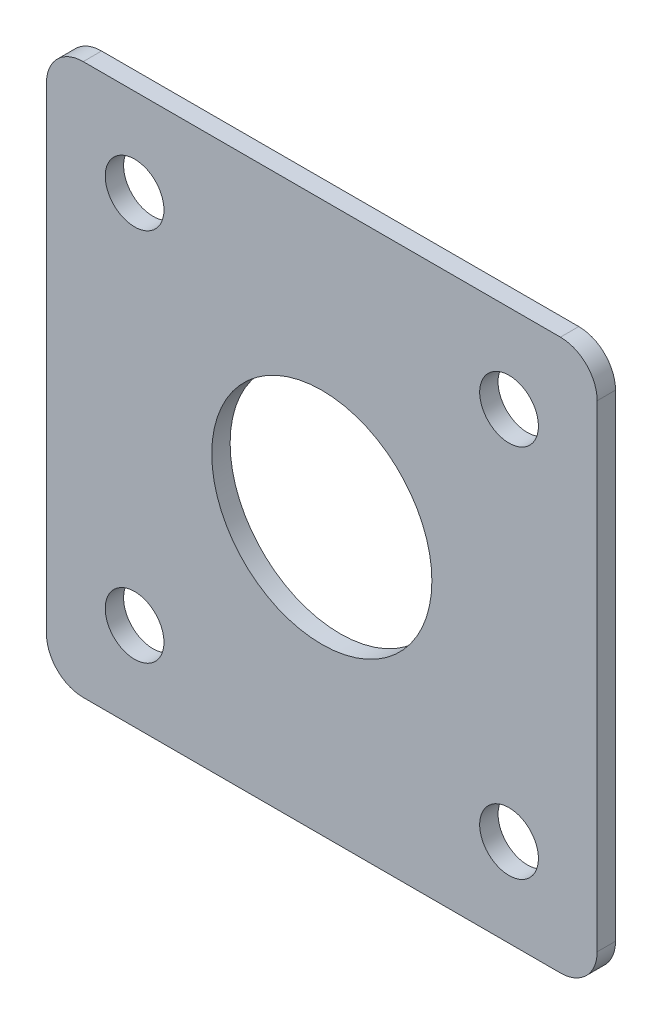
ISO-10303-21;
HEADER;
FILE_DESCRIPTION(('STEP AP214'),'2;1');
FILE_NAME('part.step','',(''),(''),'','','');
FILE_SCHEMA(('AUTOMOTIVE_DESIGN { 1 0 10303 214 1 1 1 1 }'));
ENDSEC;
DATA;
#1=APPLICATION_CONTEXT('core data for automotive mechanical design processes');
#2=APPLICATION_PROTOCOL_DEFINITION('international standard','automotive_design',2000,#1);
#3=PRODUCT_CONTEXT('',#1,'mechanical');
#4=PRODUCT('Part','Part','',(#3));
#5=PRODUCT_RELATED_PRODUCT_CATEGORY('part','',(#4));
#6=PRODUCT_DEFINITION_FORMATION('','',#4);
#7=PRODUCT_DEFINITION_CONTEXT('part definition',#1,'design');
#8=PRODUCT_DEFINITION('design','',#6,#7);
#9=PRODUCT_DEFINITION_SHAPE('','',#8);
#10=(LENGTH_UNIT() NAMED_UNIT(*) SI_UNIT(.MILLI.,.METRE.));
#11=(NAMED_UNIT(*) PLANE_ANGLE_UNIT() SI_UNIT($,.RADIAN.));
#12=(NAMED_UNIT(*) SI_UNIT($,.STERADIAN.) SOLID_ANGLE_UNIT());
#13=UNCERTAINTY_MEASURE_WITH_UNIT(LENGTH_MEASURE(1.E-05),#10,'distance_accuracy_value','');
#14=(GEOMETRIC_REPRESENTATION_CONTEXT(3) GLOBAL_UNCERTAINTY_ASSIGNED_CONTEXT((#13)) GLOBAL_UNIT_ASSIGNED_CONTEXT((#10,
#11,#12)) REPRESENTATION_CONTEXT('',''));
#15=CARTESIAN_POINT('',(0.,0.,0.));
#16=DIRECTION('',(0.,0.,1.));
#17=DIRECTION('',(1.,0.,0.));
#18=AXIS2_PLACEMENT_3D('',#15,#16,#17);
#19=CARTESIAN_POINT('',(0.,0.,5.));
#20=DIRECTION('',(0.,0.,1.));
#21=DIRECTION('',(1.,0.,0.));
#22=AXIS2_PLACEMENT_3D('',#19,#20,#21);
#23=PLANE('',#22);
#24=CARTESIAN_POINT('',(-51.,-51.,5.));
#25=DIRECTION('',(0.,0.,1.));
#26=DIRECTION('',(1.,0.,0.));
#27=AXIS2_PLACEMENT_3D('',#24,#25,#26);
#28=CIRCLE('',#27,8.);
#29=CARTESIAN_POINT('',(-43.,-51.,5.));
#30=VERTEX_POINT('',#29);
#31=EDGE_CURVE('E229',#30,#30,#28,.T.);
#32=ORIENTED_EDGE('',*,*,#31,.F.);
#33=EDGE_LOOP('',(#32));
#34=FACE_BOUND('',#33,.T.);
#35=CARTESIAN_POINT('',(51.,51.,5.));
#36=DIRECTION('',(0.,0.,1.));
#37=DIRECTION('',(1.,0.,0.));
#38=AXIS2_PLACEMENT_3D('',#35,#36,#37);
#39=CIRCLE('',#38,8.);
#40=CARTESIAN_POINT('',(59.,51.,5.));
#41=VERTEX_POINT('',#40);
#42=EDGE_CURVE('E215',#41,#41,#39,.T.);
#43=ORIENTED_EDGE('',*,*,#42,.F.);
#44=EDGE_LOOP('',(#43));
#45=FACE_BOUND('',#44,.T.);
#46=DIRECTION('',(1.,0.,0.));
#47=VECTOR('',#46,1.);
#48=CARTESIAN_POINT('',(75.,-75.,5.));
#49=LINE('',#48,#47);
#50=CARTESIAN_POINT('',(-65.,-75.,5.));
#51=VERTEX_POINT('',#50);
#52=CARTESIAN_POINT('',(65.,-75.,5.));
#53=VERTEX_POINT('',#52);
#54=EDGE_CURVE('E195',#51,#53,#49,.T.);
#55=ORIENTED_EDGE('',*,*,#54,.T.);
#56=CARTESIAN_POINT('',(65.,-65.,5.));
#57=DIRECTION('',(0.,0.,1.));
#58=DIRECTION('',(1.,0.,0.));
#59=AXIS2_PLACEMENT_3D('',#56,#57,#58);
#60=CIRCLE('',#59,10.);
#61=CARTESIAN_POINT('',(75.,-65.,5.));
#62=VERTEX_POINT('',#61);
#63=EDGE_CURVE('E168',#53,#62,#60,.T.);
#64=ORIENTED_EDGE('',*,*,#63,.T.);
#65=DIRECTION('',(0.,1.,0.));
#66=VECTOR('',#65,1.);
#67=CARTESIAN_POINT('',(75.,-75.,5.));
#68=LINE('',#67,#66);
#69=CARTESIAN_POINT('',(75.,65.,5.));
#70=VERTEX_POINT('',#69);
#71=EDGE_CURVE('E125',#62,#70,#68,.T.);
#72=ORIENTED_EDGE('',*,*,#71,.T.);
#73=CARTESIAN_POINT('',(65.,65.,5.));
#74=DIRECTION('',(0.,0.,1.));
#75=DIRECTION('',(1.,0.,0.));
#76=AXIS2_PLACEMENT_3D('',#73,#74,#75);
#77=CIRCLE('',#76,10.);
#78=CARTESIAN_POINT('',(65.,75.,5.));
#79=VERTEX_POINT('',#78);
#80=EDGE_CURVE('E60',#70,#79,#77,.T.);
#81=ORIENTED_EDGE('',*,*,#80,.T.);
#82=DIRECTION('',(-1.,0.,0.));
#83=VECTOR('',#82,1.);
#84=CARTESIAN_POINT('',(75.,75.,5.));
#85=LINE('',#84,#83);
#86=CARTESIAN_POINT('',(-65.,75.,5.));
#87=VERTEX_POINT('',#86);
#88=EDGE_CURVE('E146',#79,#87,#85,.T.);
#89=ORIENTED_EDGE('',*,*,#88,.T.);
#90=CARTESIAN_POINT('',(-65.,65.,5.));
#91=DIRECTION('',(0.,0.,1.));
#92=DIRECTION('',(1.,0.,0.));
#93=AXIS2_PLACEMENT_3D('',#90,#91,#92);
#94=CIRCLE('',#93,10.);
#95=CARTESIAN_POINT('',(-75.,65.,5.));
#96=VERTEX_POINT('',#95);
#97=EDGE_CURVE('E162',#87,#96,#94,.T.);
#98=ORIENTED_EDGE('',*,*,#97,.T.);
#99=DIRECTION('',(0.,-1.,0.));
#100=VECTOR('',#99,1.);
#101=CARTESIAN_POINT('',(-75.,-75.,5.));
#102=LINE('',#101,#100);
#103=CARTESIAN_POINT('',(-75.,-65.,5.));
#104=VERTEX_POINT('',#103);
#105=EDGE_CURVE('E139',#96,#104,#102,.T.);
#106=ORIENTED_EDGE('',*,*,#105,.T.);
#107=CARTESIAN_POINT('',(-65.,-65.,5.));
#108=DIRECTION('',(0.,0.,1.));
#109=DIRECTION('',(1.,0.,0.));
#110=AXIS2_PLACEMENT_3D('',#107,#108,#109);
#111=CIRCLE('',#110,10.);
#112=EDGE_CURVE('E165',#104,#51,#111,.T.);
#113=ORIENTED_EDGE('',*,*,#112,.T.);
#114=EDGE_LOOP('',(#55,#64,#72,#81,#89,#98,#106,#113));
#115=FACE_BOUND('',#114,.T.);
#116=CARTESIAN_POINT('',(0.,0.,5.));
#117=DIRECTION('',(0.,0.,1.));
#118=DIRECTION('',(1.,0.,0.));
#119=AXIS2_PLACEMENT_3D('',#116,#117,#118);
#120=CIRCLE('',#119,29.98);
#121=CARTESIAN_POINT('',(29.98,0.,5.));
#122=VERTEX_POINT('',#121);
#123=EDGE_CURVE('E208',#122,#122,#120,.T.);
#124=ORIENTED_EDGE('',*,*,#123,.F.);
#125=EDGE_LOOP('',(#124));
#126=FACE_BOUND('',#125,.T.);
#127=CARTESIAN_POINT('',(-51.,51.,5.));
#128=DIRECTION('',(0.,0.,1.));
#129=DIRECTION('',(1.,0.,0.));
#130=AXIS2_PLACEMENT_3D('',#127,#128,#129);
#131=CIRCLE('',#130,8.);
#132=CARTESIAN_POINT('',(-43.,51.,5.));
#133=VERTEX_POINT('',#132);
#134=EDGE_CURVE('E221',#133,#133,#131,.T.);
#135=ORIENTED_EDGE('',*,*,#134,.F.);
#136=EDGE_LOOP('',(#135));
#137=FACE_BOUND('',#136,.T.);
#138=CARTESIAN_POINT('',(51.,-51.,5.));
#139=DIRECTION('',(0.,0.,1.));
#140=DIRECTION('',(1.,0.,0.));
#141=AXIS2_PLACEMENT_3D('',#138,#139,#140);
#142=CIRCLE('',#141,8.);
#143=CARTESIAN_POINT('',(59.,-51.,5.));
#144=VERTEX_POINT('',#143);
#145=EDGE_CURVE('E237',#144,#144,#142,.T.);
#146=ORIENTED_EDGE('',*,*,#145,.F.);
#147=EDGE_LOOP('',(#146));
#148=FACE_BOUND('',#147,.T.);
#149=ADVANCED_FACE('F39',(#34,#45,#115,#126,#137,#148),#23,.T.);
#150=CARTESIAN_POINT('',(0.,0.,0.));
#151=DIRECTION('',(0.,0.,1.));
#152=DIRECTION('',(1.,0.,0.));
#153=AXIS2_PLACEMENT_3D('',#150,#151,#152);
#154=PLANE('',#153);
#155=DIRECTION('',(0.,1.,0.));
#156=VECTOR('',#155,1.);
#157=CARTESIAN_POINT('',(75.,-75.,0.));
#158=LINE('',#157,#156);
#159=CARTESIAN_POINT('',(75.,-65.,0.));
#160=VERTEX_POINT('',#159);
#161=CARTESIAN_POINT('',(75.,65.,0.));
#162=VERTEX_POINT('',#161);
#163=EDGE_CURVE('E123',#160,#162,#158,.T.);
#164=ORIENTED_EDGE('',*,*,#163,.F.);
#165=CARTESIAN_POINT('',(65.,-65.,0.));
#166=DIRECTION('',(0.,0.,1.));
#167=DIRECTION('',(1.,0.,0.));
#168=AXIS2_PLACEMENT_3D('',#165,#166,#167);
#169=CIRCLE('',#168,10.);
#170=CARTESIAN_POINT('',(65.,-75.,0.));
#171=VERTEX_POINT('',#170);
#172=EDGE_CURVE('E105',#160,#171,#169,.F.);
#173=ORIENTED_EDGE('',*,*,#172,.T.);
#174=DIRECTION('',(1.,0.,0.));
#175=VECTOR('',#174,1.);
#176=CARTESIAN_POINT('',(75.,-75.,0.));
#177=LINE('',#176,#175);
#178=CARTESIAN_POINT('',(-65.,-75.,0.));
#179=VERTEX_POINT('',#178);
#180=EDGE_CURVE('E135',#179,#171,#177,.T.);
#181=ORIENTED_EDGE('',*,*,#180,.F.);
#182=CARTESIAN_POINT('',(-65.,-65.,0.));
#183=DIRECTION('',(0.,0.,1.));
#184=DIRECTION('',(1.,0.,0.));
#185=AXIS2_PLACEMENT_3D('',#182,#183,#184);
#186=CIRCLE('',#185,10.);
#187=CARTESIAN_POINT('',(-75.,-65.,0.));
#188=VERTEX_POINT('',#187);
#189=EDGE_CURVE('E117',#179,#188,#186,.F.);
#190=ORIENTED_EDGE('',*,*,#189,.T.);
#191=DIRECTION('',(0.,-1.,0.));
#192=VECTOR('',#191,1.);
#193=CARTESIAN_POINT('',(-75.,-75.,0.));
#194=LINE('',#193,#192);
#195=CARTESIAN_POINT('',(-75.,65.,0.));
#196=VERTEX_POINT('',#195);
#197=EDGE_CURVE('E141',#196,#188,#194,.T.);
#198=ORIENTED_EDGE('',*,*,#197,.F.);
#199=CARTESIAN_POINT('',(-65.,65.,0.));
#200=DIRECTION('',(0.,0.,1.));
#201=DIRECTION('',(1.,0.,0.));
#202=AXIS2_PLACEMENT_3D('',#199,#200,#201);
#203=CIRCLE('',#202,10.);
#204=CARTESIAN_POINT('',(-65.,75.,0.));
#205=VERTEX_POINT('',#204);
#206=EDGE_CURVE('E150',#196,#205,#203,.F.);
#207=ORIENTED_EDGE('',*,*,#206,.T.);
#208=DIRECTION('',(-1.,0.,0.));
#209=VECTOR('',#208,1.);
#210=CARTESIAN_POINT('',(75.,75.,0.));
#211=LINE('',#210,#209);
#212=CARTESIAN_POINT('',(65.,75.,0.));
#213=VERTEX_POINT('',#212);
#214=EDGE_CURVE('E134',#213,#205,#211,.T.);
#215=ORIENTED_EDGE('',*,*,#214,.F.);
#216=CARTESIAN_POINT('',(65.,65.,0.));
#217=DIRECTION('',(0.,0.,1.));
#218=DIRECTION('',(1.,0.,0.));
#219=AXIS2_PLACEMENT_3D('',#216,#217,#218);
#220=CIRCLE('',#219,10.);
#221=EDGE_CURVE('E127',#213,#162,#220,.F.);
#222=ORIENTED_EDGE('',*,*,#221,.T.);
#223=EDGE_LOOP('',(#164,#173,#181,#190,#198,#207,#215,#222));
#224=FACE_BOUND('',#223,.T.);
#225=CARTESIAN_POINT('',(0.,0.,0.));
#226=DIRECTION('',(0.,0.,1.));
#227=DIRECTION('',(1.,0.,0.));
#228=AXIS2_PLACEMENT_3D('',#225,#226,#227);
#229=CIRCLE('',#228,29.98);
#230=CARTESIAN_POINT('',(29.98,0.,0.));
#231=VERTEX_POINT('',#230);
#232=EDGE_CURVE('E201',#231,#231,#229,.T.);
#233=ORIENTED_EDGE('',*,*,#232,.T.);
#234=EDGE_LOOP('',(#233));
#235=FACE_BOUND('',#234,.T.);
#236=CARTESIAN_POINT('',(51.,51.,0.));
#237=DIRECTION('',(0.,0.,1.));
#238=DIRECTION('',(1.,0.,0.));
#239=AXIS2_PLACEMENT_3D('',#236,#237,#238);
#240=CIRCLE('',#239,8.);
#241=CARTESIAN_POINT('',(59.,51.,0.));
#242=VERTEX_POINT('',#241);
#243=EDGE_CURVE('E217',#242,#242,#240,.T.);
#244=ORIENTED_EDGE('',*,*,#243,.T.);
#245=EDGE_LOOP('',(#244));
#246=FACE_BOUND('',#245,.T.);
#247=CARTESIAN_POINT('',(-51.,51.,0.));
#248=DIRECTION('',(0.,0.,1.));
#249=DIRECTION('',(1.,0.,0.));
#250=AXIS2_PLACEMENT_3D('',#247,#248,#249);
#251=CIRCLE('',#250,8.);
#252=CARTESIAN_POINT('',(-43.,51.,0.));
#253=VERTEX_POINT('',#252);
#254=EDGE_CURVE('E225',#253,#253,#251,.T.);
#255=ORIENTED_EDGE('',*,*,#254,.T.);
#256=EDGE_LOOP('',(#255));
#257=FACE_BOUND('',#256,.T.);
#258=CARTESIAN_POINT('',(-51.,-51.,0.));
#259=DIRECTION('',(0.,0.,1.));
#260=DIRECTION('',(1.,0.,0.));
#261=AXIS2_PLACEMENT_3D('',#258,#259,#260);
#262=CIRCLE('',#261,8.);
#263=CARTESIAN_POINT('',(-43.,-51.,0.));
#264=VERTEX_POINT('',#263);
#265=EDGE_CURVE('E233',#264,#264,#262,.T.);
#266=ORIENTED_EDGE('',*,*,#265,.T.);
#267=EDGE_LOOP('',(#266));
#268=FACE_BOUND('',#267,.T.);
#269=CARTESIAN_POINT('',(51.,-51.,0.));
#270=DIRECTION('',(0.,0.,1.));
#271=DIRECTION('',(1.,0.,0.));
#272=AXIS2_PLACEMENT_3D('',#269,#270,#271);
#273=CIRCLE('',#272,8.);
#274=CARTESIAN_POINT('',(59.,-51.,0.));
#275=VERTEX_POINT('',#274);
#276=EDGE_CURVE('E241',#275,#275,#273,.T.);
#277=ORIENTED_EDGE('',*,*,#276,.T.);
#278=EDGE_LOOP('',(#277));
#279=FACE_BOUND('',#278,.T.);
#280=ADVANCED_FACE('F130',(#224,#235,#246,#257,#268,#279),#154,.F.);
#281=CARTESIAN_POINT('',(-75.,-75.,5.));
#282=DIRECTION('',(1.,0.,0.));
#283=DIRECTION('',(0.,0.,-1.));
#284=AXIS2_PLACEMENT_3D('',#281,#282,#283);
#285=PLANE('',#284);
#286=ORIENTED_EDGE('',*,*,#197,.T.);
#287=DIRECTION('',(0.,0.,-1.));
#288=VECTOR('',#287,1.);
#289=CARTESIAN_POINT('',(-75.,-65.,5.));
#290=LINE('',#289,#288);
#291=EDGE_CURVE('E175',#188,#104,#290,.F.);
#292=ORIENTED_EDGE('',*,*,#291,.T.);
#293=ORIENTED_EDGE('',*,*,#105,.F.);
#294=DIRECTION('',(0.,0.,-1.));
#295=VECTOR('',#294,1.);
#296=CARTESIAN_POINT('',(-75.,65.,5.));
#297=LINE('',#296,#295);
#298=EDGE_CURVE('E171',#96,#196,#297,.T.);
#299=ORIENTED_EDGE('',*,*,#298,.T.);
#300=EDGE_LOOP('',(#286,#292,#293,#299));
#301=FACE_BOUND('',#300,.T.);
#302=ADVANCED_FACE('F190',(#301),#285,.F.);
#303=CARTESIAN_POINT('',(75.,-75.,5.));
#304=DIRECTION('',(0.,1.,0.));
#305=DIRECTION('',(-1.,0.,0.));
#306=AXIS2_PLACEMENT_3D('',#303,#304,#305);
#307=PLANE('',#306);
#308=ORIENTED_EDGE('',*,*,#180,.T.);
#309=DIRECTION('',(0.,0.,-1.));
#310=VECTOR('',#309,1.);
#311=CARTESIAN_POINT('',(65.,-75.,5.));
#312=LINE('',#311,#310);
#313=EDGE_CURVE('E110',#171,#53,#312,.F.);
#314=ORIENTED_EDGE('',*,*,#313,.T.);
#315=ORIENTED_EDGE('',*,*,#54,.F.);
#316=DIRECTION('',(0.,0.,-1.));
#317=VECTOR('',#316,1.);
#318=CARTESIAN_POINT('',(-65.,-75.,5.));
#319=LINE('',#318,#317);
#320=EDGE_CURVE('E116',#51,#179,#319,.T.);
#321=ORIENTED_EDGE('',*,*,#320,.T.);
#322=EDGE_LOOP('',(#308,#314,#315,#321));
#323=FACE_BOUND('',#322,.T.);
#324=ADVANCED_FACE('F269',(#323),#307,.F.);
#325=CARTESIAN_POINT('',(75.,-75.,5.));
#326=DIRECTION('',(-1.,0.,0.));
#327=DIRECTION('',(0.,0.,1.));
#328=AXIS2_PLACEMENT_3D('',#325,#326,#327);
#329=PLANE('',#328);
#330=ORIENTED_EDGE('',*,*,#71,.F.);
#331=DIRECTION('',(0.,0.,-1.));
#332=VECTOR('',#331,1.);
#333=CARTESIAN_POINT('',(75.,-65.,5.));
#334=LINE('',#333,#332);
#335=EDGE_CURVE('E109',#62,#160,#334,.T.);
#336=ORIENTED_EDGE('',*,*,#335,.T.);
#337=ORIENTED_EDGE('',*,*,#163,.T.);
#338=DIRECTION('',(0.,0.,-1.));
#339=VECTOR('',#338,1.);
#340=CARTESIAN_POINT('',(75.,65.,5.));
#341=LINE('',#340,#339);
#342=EDGE_CURVE('E128',#162,#70,#341,.F.);
#343=ORIENTED_EDGE('',*,*,#342,.T.);
#344=EDGE_LOOP('',(#330,#336,#337,#343));
#345=FACE_BOUND('',#344,.T.);
#346=ADVANCED_FACE('F122',(#345),#329,.F.);
#347=CARTESIAN_POINT('',(75.,75.,5.));
#348=DIRECTION('',(0.,-1.,0.));
#349=DIRECTION('',(1.,0.,0.));
#350=AXIS2_PLACEMENT_3D('',#347,#348,#349);
#351=PLANE('',#350);
#352=ORIENTED_EDGE('',*,*,#214,.T.);
#353=DIRECTION('',(0.,0.,-1.));
#354=VECTOR('',#353,1.);
#355=CARTESIAN_POINT('',(-65.,75.,5.));
#356=LINE('',#355,#354);
#357=EDGE_CURVE('E11',#205,#87,#356,.F.);
#358=ORIENTED_EDGE('',*,*,#357,.T.);
#359=ORIENTED_EDGE('',*,*,#88,.F.);
#360=DIRECTION('',(0.,0.,-1.));
#361=VECTOR('',#360,1.);
#362=CARTESIAN_POINT('',(65.,75.,5.));
#363=LINE('',#362,#361);
#364=EDGE_CURVE('E48',#79,#213,#363,.T.);
#365=ORIENTED_EDGE('',*,*,#364,.T.);
#366=EDGE_LOOP('',(#352,#358,#359,#365));
#367=FACE_BOUND('',#366,.T.);
#368=ADVANCED_FACE('F180',(#367),#351,.F.);
#369=CARTESIAN_POINT('',(0.,0.,5.));
#370=DIRECTION('',(0.,0.,-1.));
#371=DIRECTION('',(-1.,0.,0.));
#372=AXIS2_PLACEMENT_3D('',#369,#370,#371);
#373=CYLINDRICAL_SURFACE('',#372,29.98);
#374=ORIENTED_EDGE('',*,*,#123,.T.);
#375=EDGE_LOOP('',(#374));
#376=FACE_BOUND('',#375,.T.);
#377=ORIENTED_EDGE('',*,*,#232,.F.);
#378=EDGE_LOOP('',(#377));
#379=FACE_BOUND('',#378,.T.);
#380=ADVANCED_FACE('F262',(#376,#379),#373,.F.);
#381=CARTESIAN_POINT('',(51.,51.,5.));
#382=DIRECTION('',(0.,0.,-1.));
#383=DIRECTION('',(-1.,0.,0.));
#384=AXIS2_PLACEMENT_3D('',#381,#382,#383);
#385=CYLINDRICAL_SURFACE('',#384,8.);
#386=ORIENTED_EDGE('',*,*,#42,.T.);
#387=EDGE_LOOP('',(#386));
#388=FACE_BOUND('',#387,.T.);
#389=ORIENTED_EDGE('',*,*,#243,.F.);
#390=EDGE_LOOP('',(#389));
#391=FACE_BOUND('',#390,.T.);
#392=ADVANCED_FACE('F296',(#388,#391),#385,.F.);
#393=CARTESIAN_POINT('',(-51.,51.,5.));
#394=DIRECTION('',(0.,0.,-1.));
#395=DIRECTION('',(-1.,0.,0.));
#396=AXIS2_PLACEMENT_3D('',#393,#394,#395);
#397=CYLINDRICAL_SURFACE('',#396,8.);
#398=ORIENTED_EDGE('',*,*,#134,.T.);
#399=EDGE_LOOP('',(#398));
#400=FACE_BOUND('',#399,.T.);
#401=ORIENTED_EDGE('',*,*,#254,.F.);
#402=EDGE_LOOP('',(#401));
#403=FACE_BOUND('',#402,.T.);
#404=ADVANCED_FACE('F292',(#400,#403),#397,.F.);
#405=CARTESIAN_POINT('',(-51.,-51.,5.));
#406=DIRECTION('',(0.,0.,-1.));
#407=DIRECTION('',(-1.,0.,0.));
#408=AXIS2_PLACEMENT_3D('',#405,#406,#407);
#409=CYLINDRICAL_SURFACE('',#408,8.);
#410=ORIENTED_EDGE('',*,*,#31,.T.);
#411=EDGE_LOOP('',(#410));
#412=FACE_BOUND('',#411,.T.);
#413=ORIENTED_EDGE('',*,*,#265,.F.);
#414=EDGE_LOOP('',(#413));
#415=FACE_BOUND('',#414,.T.);
#416=ADVANCED_FACE('F295',(#412,#415),#409,.F.);
#417=CARTESIAN_POINT('',(51.,-51.,5.));
#418=DIRECTION('',(0.,0.,-1.));
#419=DIRECTION('',(-1.,0.,0.));
#420=AXIS2_PLACEMENT_3D('',#417,#418,#419);
#421=CYLINDRICAL_SURFACE('',#420,8.);
#422=ORIENTED_EDGE('',*,*,#145,.T.);
#423=EDGE_LOOP('',(#422));
#424=FACE_BOUND('',#423,.T.);
#425=ORIENTED_EDGE('',*,*,#276,.F.);
#426=EDGE_LOOP('',(#425));
#427=FACE_BOUND('',#426,.T.);
#428=ADVANCED_FACE('F249',(#424,#427),#421,.F.);
#429=CARTESIAN_POINT('',(65.,-65.,5.));
#430=DIRECTION('',(0.,0.,-1.));
#431=DIRECTION('',(-1.,0.,0.));
#432=AXIS2_PLACEMENT_3D('',#429,#430,#431);
#433=CYLINDRICAL_SURFACE('',#432,10.);
#434=ORIENTED_EDGE('',*,*,#63,.F.);
#435=ORIENTED_EDGE('',*,*,#313,.F.);
#436=ORIENTED_EDGE('',*,*,#172,.F.);
#437=ORIENTED_EDGE('',*,*,#335,.F.);
#438=EDGE_LOOP('',(#434,#435,#436,#437));
#439=FACE_BOUND('',#438,.T.);
#440=ADVANCED_FACE('F108',(#439),#433,.T.);
#441=CARTESIAN_POINT('',(-65.,-65.,5.));
#442=DIRECTION('',(0.,0.,-1.));
#443=DIRECTION('',(-1.,0.,0.));
#444=AXIS2_PLACEMENT_3D('',#441,#442,#443);
#445=CYLINDRICAL_SURFACE('',#444,10.);
#446=ORIENTED_EDGE('',*,*,#112,.F.);
#447=ORIENTED_EDGE('',*,*,#291,.F.);
#448=ORIENTED_EDGE('',*,*,#189,.F.);
#449=ORIENTED_EDGE('',*,*,#320,.F.);
#450=EDGE_LOOP('',(#446,#447,#448,#449));
#451=FACE_BOUND('',#450,.T.);
#452=ADVANCED_FACE('F277',(#451),#445,.T.);
#453=CARTESIAN_POINT('',(-65.,65.,5.));
#454=DIRECTION('',(0.,0.,-1.));
#455=DIRECTION('',(-1.,0.,0.));
#456=AXIS2_PLACEMENT_3D('',#453,#454,#455);
#457=CYLINDRICAL_SURFACE('',#456,10.);
#458=ORIENTED_EDGE('',*,*,#97,.F.);
#459=ORIENTED_EDGE('',*,*,#357,.F.);
#460=ORIENTED_EDGE('',*,*,#206,.F.);
#461=ORIENTED_EDGE('',*,*,#298,.F.);
#462=EDGE_LOOP('',(#458,#459,#460,#461));
#463=FACE_BOUND('',#462,.T.);
#464=ADVANCED_FACE('F187',(#463),#457,.T.);
#465=CARTESIAN_POINT('',(65.,65.,5.));
#466=DIRECTION('',(0.,0.,-1.));
#467=DIRECTION('',(-1.,0.,0.));
#468=AXIS2_PLACEMENT_3D('',#465,#466,#467);
#469=CYLINDRICAL_SURFACE('',#468,10.);
#470=ORIENTED_EDGE('',*,*,#80,.F.);
#471=ORIENTED_EDGE('',*,*,#342,.F.);
#472=ORIENTED_EDGE('',*,*,#221,.F.);
#473=ORIENTED_EDGE('',*,*,#364,.F.);
#474=EDGE_LOOP('',(#470,#471,#472,#473));
#475=FACE_BOUND('',#474,.T.);
#476=ADVANCED_FACE('F41',(#475),#469,.T.);
#477=CLOSED_SHELL('',(#149,#280,#302,#324,#346,#368,#380,#392,#404,#416,#428,#440,#452,#464,#476));
#478=MANIFOLD_SOLID_BREP('B2',#477);
#479=ADVANCED_BREP_SHAPE_REPRESENTATION('',(#18,#478),#14);
#480=SHAPE_DEFINITION_REPRESENTATION(#9,#479);
ENDSEC;
END-ISO-10303-21;
